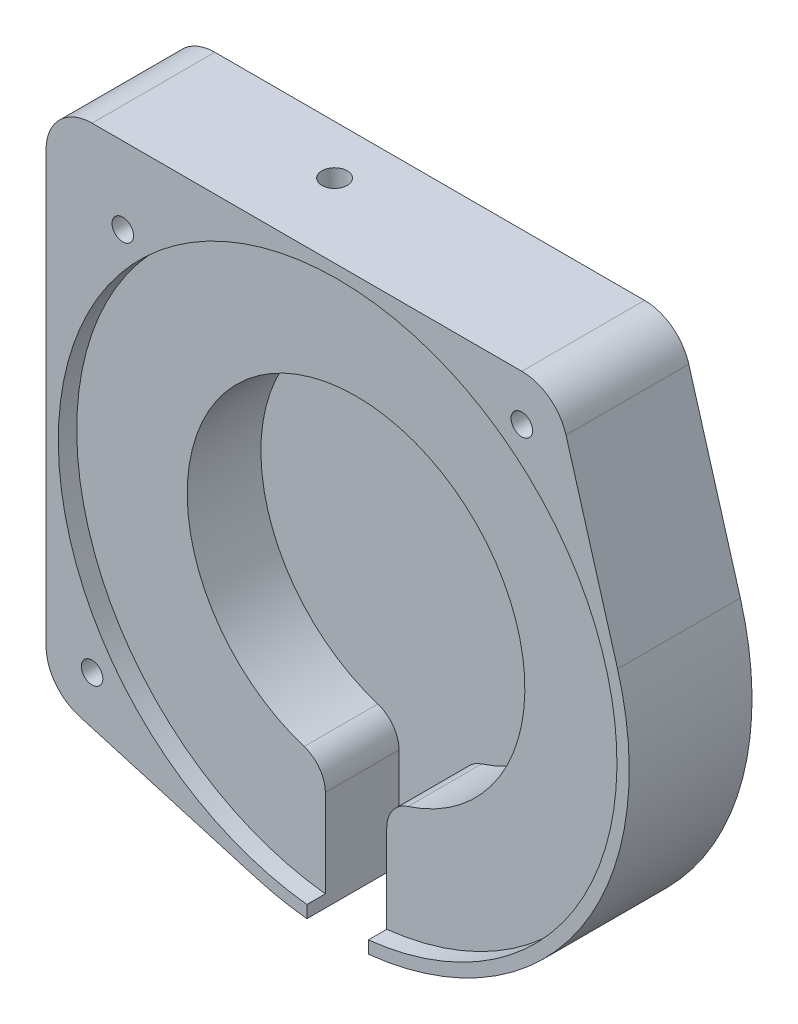
ISO-10303-21;
HEADER;
FILE_DESCRIPTION(('STEP AP214'),'2;1');
FILE_NAME('part.step','',(''),(''),'','','');
FILE_SCHEMA(('AUTOMOTIVE_DESIGN { 1 0 10303 214 1 1 1 1 }'));
ENDSEC;
DATA;
#1=APPLICATION_CONTEXT('core data for automotive mechanical design processes');
#2=APPLICATION_PROTOCOL_DEFINITION('international standard','automotive_design',2000,#1);
#3=PRODUCT_CONTEXT('',#1,'mechanical');
#4=PRODUCT('Part','Part','',(#3));
#5=PRODUCT_RELATED_PRODUCT_CATEGORY('part','',(#4));
#6=PRODUCT_DEFINITION_FORMATION('','',#4);
#7=PRODUCT_DEFINITION_CONTEXT('part definition',#1,'design');
#8=PRODUCT_DEFINITION('design','',#6,#7);
#9=PRODUCT_DEFINITION_SHAPE('','',#8);
#10=(LENGTH_UNIT() NAMED_UNIT(*) SI_UNIT(.MILLI.,.METRE.));
#11=(NAMED_UNIT(*) PLANE_ANGLE_UNIT() SI_UNIT($,.RADIAN.));
#12=(NAMED_UNIT(*) SI_UNIT($,.STERADIAN.) SOLID_ANGLE_UNIT());
#13=UNCERTAINTY_MEASURE_WITH_UNIT(LENGTH_MEASURE(1.E-05),#10,'distance_accuracy_value','');
#14=(GEOMETRIC_REPRESENTATION_CONTEXT(3) GLOBAL_UNCERTAINTY_ASSIGNED_CONTEXT((#13)) GLOBAL_UNIT_ASSIGNED_CONTEXT((#10,
#11,#12)) REPRESENTATION_CONTEXT('',''));
#15=CARTESIAN_POINT('',(0.,0.,0.));
#16=DIRECTION('',(0.,0.,1.));
#17=DIRECTION('',(1.,0.,0.));
#18=AXIS2_PLACEMENT_3D('',#15,#16,#17);
#19=CARTESIAN_POINT('',(-35.5000000012069,12.5,8.));
#20=DIRECTION('',(-1.,0.,0.));
#21=DIRECTION('',(0.,0.,1.));
#22=AXIS2_PLACEMENT_3D('',#19,#20,#21);
#23=CONICAL_SURFACE('',#22,2.06699999931016,1.02974425749021);
#24=CARTESIAN_POINT('',(-34.2580210987649,12.5,7.99999999998136));
#25=VERTEX_POINT('',#24);
#26=VERTEX_LOOP('',#25);
#27=FACE_BOUND('',#26,.T.);
#28=CARTESIAN_POINT('',(-35.5,12.5,8.));
#29=DIRECTION('',(-1.,0.,0.));
#30=DIRECTION('',(0.,-1.,0.));
#31=AXIS2_PLACEMENT_3D('',#28,#29,#30);
#32=CIRCLE('',#31,2.067);
#33=CARTESIAN_POINT('',(-35.5,10.433,8.));
#34=VERTEX_POINT('',#33);
#35=EDGE_CURVE('E247',#34,#34,#32,.T.);
#36=ORIENTED_EDGE('',*,*,#35,.T.);
#37=EDGE_LOOP('',(#36));
#38=FACE_BOUND('',#37,.T.);
#39=ADVANCED_FACE('F17',(#27,#38),#23,.F.);
#40=CARTESIAN_POINT('',(0.,0.,17.));
#41=DIRECTION('',(0.,0.,-1.));
#42=DIRECTION('',(-1.,0.,0.));
#43=AXIS2_PLACEMENT_3D('',#40,#41,#42);
#44=PLANE('',#43);
#45=CARTESIAN_POINT('',(-9.99999999999999,-30.9232921921325,17.));
#46=DIRECTION('',(0.,0.,-1.));
#47=DIRECTION('',(-1.,0.,0.));
#48=AXIS2_PLACEMENT_3D('',#45,#46,#47);
#49=CIRCLE('',#48,5.00000000000001);
#50=CARTESIAN_POINT('',(-8.46153846153846,-26.1658626241121,17.));
#51=VERTEX_POINT('',#50);
#52=CARTESIAN_POINT('',(-4.99999999999999,-30.9232921921325,17.));
#53=VERTEX_POINT('',#52);
#54=EDGE_CURVE('E249',#51,#53,#49,.T.);
#55=ORIENTED_EDGE('',*,*,#54,.F.);
#56=CARTESIAN_POINT('',(0.,0.,17.));
#57=DIRECTION('',(0.,0.,-1.));
#58=DIRECTION('',(-1.,0.,0.));
#59=AXIS2_PLACEMENT_3D('',#56,#57,#58);
#60=CIRCLE('',#59,27.5);
#61=CARTESIAN_POINT('',(8.46153846153848,-26.1658626241121,17.));
#62=VERTEX_POINT('',#61);
#63=EDGE_CURVE('E139',#51,#62,#60,.T.);
#64=ORIENTED_EDGE('',*,*,#63,.T.);
#65=CARTESIAN_POINT('',(10.,-30.9232921921325,17.));
#66=DIRECTION('',(0.,0.,-1.));
#67=DIRECTION('',(-1.,0.,0.));
#68=AXIS2_PLACEMENT_3D('',#65,#66,#67);
#69=CIRCLE('',#68,5.00000000000002);
#70=CARTESIAN_POINT('',(5.00000000000003,-30.9232921921325,17.));
#71=VERTEX_POINT('',#70);
#72=EDGE_CURVE('E20',#71,#62,#69,.T.);
#73=ORIENTED_EDGE('',*,*,#72,.F.);
#74=DIRECTION('',(0.,1.,0.));
#75=VECTOR('',#74,1.);
#76=CARTESIAN_POINT('',(5.00000000000003,-54.6353623105085,17.));
#77=LINE('',#76,#75);
#78=CARTESIAN_POINT('',(5.00000000000003,-45.224440295044,17.));
#79=VERTEX_POINT('',#78);
#80=EDGE_CURVE('E138',#71,#79,#77,.F.);
#81=ORIENTED_EDGE('',*,*,#80,.T.);
#82=CARTESIAN_POINT('',(0.,0.,17.));
#83=DIRECTION('',(0.,0.,-1.));
#84=DIRECTION('',(-1.,0.,0.));
#85=AXIS2_PLACEMENT_3D('',#82,#83,#84);
#86=CIRCLE('',#85,45.5);
#87=CARTESIAN_POINT('',(-4.99999999999999,-45.224440295044,17.));
#88=VERTEX_POINT('',#87);
#89=EDGE_CURVE('E244',#79,#88,#86,.F.);
#90=ORIENTED_EDGE('',*,*,#89,.T.);
#91=DIRECTION('',(0.,1.,0.));
#92=VECTOR('',#91,1.);
#93=CARTESIAN_POINT('',(-4.99999999999999,-30.9232921921325,17.));
#94=LINE('',#93,#92);
#95=EDGE_CURVE('E160',#88,#53,#94,.T.);
#96=ORIENTED_EDGE('',*,*,#95,.T.);
#97=EDGE_LOOP('',(#55,#64,#73,#81,#90,#96));
#98=FACE_BOUND('',#97,.T.);
#99=ADVANCED_FACE('F137',(#98),#44,.F.);
#100=CARTESIAN_POINT('',(10.,-30.9232921921325,20.));
#101=DIRECTION('',(0.,0.,-1.));
#102=DIRECTION('',(-1.,0.,0.));
#103=AXIS2_PLACEMENT_3D('',#100,#101,#102);
#104=CYLINDRICAL_SURFACE('',#103,5.00000000000002);
#105=CARTESIAN_POINT('',(10.,-30.9232921921325,5.));
#106=DIRECTION('',(0.,0.,-1.));
#107=DIRECTION('',(-1.,0.,0.));
#108=AXIS2_PLACEMENT_3D('',#105,#106,#107);
#109=CIRCLE('',#108,5.00000000000002);
#110=CARTESIAN_POINT('',(5.00000000000002,-30.9232921921325,5.));
#111=VERTEX_POINT('',#110);
#112=CARTESIAN_POINT('',(8.46153846153848,-26.1658626241121,5.));
#113=VERTEX_POINT('',#112);
#114=EDGE_CURVE('E158',#111,#113,#109,.T.);
#115=ORIENTED_EDGE('',*,*,#114,.F.);
#116=DIRECTION('',(0.,0.,-1.));
#117=VECTOR('',#116,1.);
#118=CARTESIAN_POINT('',(5.00000000000003,-30.9232921921325,20.));
#119=LINE('',#118,#117);
#120=EDGE_CURVE('E149',#111,#71,#119,.F.);
#121=ORIENTED_EDGE('',*,*,#120,.T.);
#122=ORIENTED_EDGE('',*,*,#72,.T.);
#123=DIRECTION('',(0.,0.,-1.));
#124=VECTOR('',#123,1.);
#125=CARTESIAN_POINT('',(8.46153846153848,-26.1658626241121,20.));
#126=LINE('',#125,#124);
#127=EDGE_CURVE('E144',#62,#113,#126,.T.);
#128=ORIENTED_EDGE('',*,*,#127,.T.);
#129=EDGE_LOOP('',(#115,#121,#122,#128));
#130=FACE_BOUND('',#129,.T.);
#131=ADVANCED_FACE('F157',(#130),#104,.T.);
#132=CARTESIAN_POINT('',(0.,0.,20.));
#133=DIRECTION('',(0.,0.,-1.));
#134=DIRECTION('',(-1.,0.,0.));
#135=AXIS2_PLACEMENT_3D('',#132,#133,#134);
#136=CYLINDRICAL_SURFACE('',#135,27.5);
#137=DIRECTION('',(0.,0.,-1.));
#138=VECTOR('',#137,1.);
#139=CARTESIAN_POINT('',(-8.46153846153846,-26.1658626241121,20.));
#140=LINE('',#139,#138);
#141=CARTESIAN_POINT('',(-8.46153846153846,-26.1658626241121,5.));
#142=VERTEX_POINT('',#141);
#143=EDGE_CURVE('E248',#142,#51,#140,.F.);
#144=ORIENTED_EDGE('',*,*,#143,.F.);
#145=CARTESIAN_POINT('',(0.,0.,5.));
#146=DIRECTION('',(0.,0.,-1.));
#147=DIRECTION('',(-1.,0.,0.));
#148=AXIS2_PLACEMENT_3D('',#145,#146,#147);
#149=CIRCLE('',#148,27.5);
#150=EDGE_CURVE('E240',#113,#142,#149,.F.);
#151=ORIENTED_EDGE('',*,*,#150,.F.);
#152=ORIENTED_EDGE('',*,*,#127,.F.);
#153=ORIENTED_EDGE('',*,*,#63,.F.);
#154=EDGE_LOOP('',(#144,#151,#152,#153));
#155=FACE_BOUND('',#154,.T.);
#156=ADVANCED_FACE('F253',(#155),#136,.F.);
#157=CARTESIAN_POINT('',(-9.99999999999999,-30.9232921921325,20.));
#158=DIRECTION('',(0.,0.,-1.));
#159=DIRECTION('',(-1.,0.,0.));
#160=AXIS2_PLACEMENT_3D('',#157,#158,#159);
#161=CYLINDRICAL_SURFACE('',#160,5.00000000000001);
#162=CARTESIAN_POINT('',(-9.99999999999999,-30.9232921921325,5.));
#163=DIRECTION('',(0.,0.,-1.));
#164=DIRECTION('',(-1.,0.,0.));
#165=AXIS2_PLACEMENT_3D('',#162,#163,#164);
#166=CIRCLE('',#165,5.00000000000001);
#167=CARTESIAN_POINT('',(-4.99999999999999,-30.9232921921325,5.));
#168=VERTEX_POINT('',#167);
#169=EDGE_CURVE('E237',#142,#168,#166,.T.);
#170=ORIENTED_EDGE('',*,*,#169,.F.);
#171=ORIENTED_EDGE('',*,*,#143,.T.);
#172=ORIENTED_EDGE('',*,*,#54,.T.);
#173=DIRECTION('',(0.,0.,1.));
#174=VECTOR('',#173,1.);
#175=CARTESIAN_POINT('',(-4.99999999999999,-30.9232921921325,20.));
#176=LINE('',#175,#174);
#177=EDGE_CURVE('E276',#53,#168,#176,.F.);
#178=ORIENTED_EDGE('',*,*,#177,.T.);
#179=EDGE_LOOP('',(#170,#171,#172,#178));
#180=FACE_BOUND('',#179,.T.);
#181=ADVANCED_FACE('F282',(#180),#161,.T.);
#182=CARTESIAN_POINT('',(-12.5,35.5000000012069,8.));
#183=DIRECTION('',(0.,1.,0.));
#184=DIRECTION('',(0.,0.,1.));
#185=AXIS2_PLACEMENT_3D('',#182,#183,#184);
#186=CONICAL_SURFACE('',#185,2.06699999928334,1.02974425746661);
#187=CARTESIAN_POINT('',(-12.5000000001023,34.2580210987649,8.));
#188=VERTEX_POINT('',#187);
#189=VERTEX_LOOP('',#188);
#190=FACE_BOUND('',#189,.T.);
#191=CARTESIAN_POINT('',(-12.5,35.5,8.));
#192=DIRECTION('',(0.,1.,0.));
#193=DIRECTION('',(-1.,0.,0.));
#194=AXIS2_PLACEMENT_3D('',#191,#192,#193);
#195=CIRCLE('',#194,2.067);
#196=CARTESIAN_POINT('',(-14.567,35.5,8.));
#197=VERTEX_POINT('',#196);
#198=EDGE_CURVE('E299',#197,#197,#195,.T.);
#199=ORIENTED_EDGE('',*,*,#198,.T.);
#200=EDGE_LOOP('',(#199));
#201=FACE_BOUND('',#200,.T.);
#202=ADVANCED_FACE('F424',(#190,#201),#186,.F.);
#203=CARTESIAN_POINT('',(0.,0.,20.));
#204=DIRECTION('',(0.,0.,-1.));
#205=DIRECTION('',(-1.,0.,0.));
#206=AXIS2_PLACEMENT_3D('',#203,#204,#205);
#207=CYLINDRICAL_SURFACE('',#206,45.5);
#208=ORIENTED_EDGE('',*,*,#89,.F.);
#209=DIRECTION('',(0.,0.,-1.));
#210=VECTOR('',#209,1.);
#211=CARTESIAN_POINT('',(5.00000000000003,-45.224440295044,20.));
#212=LINE('',#211,#210);
#213=CARTESIAN_POINT('',(5.00000000000002,-45.224440295044,20.));
#214=VERTEX_POINT('',#213);
#215=EDGE_CURVE('E153',#79,#214,#212,.F.);
#216=ORIENTED_EDGE('',*,*,#215,.T.);
#217=CARTESIAN_POINT('',(0.,0.,20.));
#218=DIRECTION('',(0.,0.,-1.));
#219=DIRECTION('',(-1.,0.,0.));
#220=AXIS2_PLACEMENT_3D('',#217,#218,#219);
#221=CIRCLE('',#220,45.5);
#222=CARTESIAN_POINT('',(-4.99999999999998,-45.224440295044,20.));
#223=VERTEX_POINT('',#222);
#224=EDGE_CURVE('E233',#223,#214,#221,.T.);
#225=ORIENTED_EDGE('',*,*,#224,.F.);
#226=DIRECTION('',(0.,0.,1.));
#227=VECTOR('',#226,1.);
#228=CARTESIAN_POINT('',(-4.99999999999999,-45.224440295044,20.));
#229=LINE('',#228,#227);
#230=EDGE_CURVE('E166',#223,#88,#229,.F.);
#231=ORIENTED_EDGE('',*,*,#230,.T.);
#232=EDGE_LOOP('',(#208,#216,#225,#231));
#233=FACE_BOUND('',#232,.T.);
#234=ADVANCED_FACE('F292',(#233),#207,.F.);
#235=CARTESIAN_POINT('',(-41.5,12.5,8.));
#236=DIRECTION('',(-1.,0.,0.));
#237=DIRECTION('',(0.,-1.,0.));
#238=AXIS2_PLACEMENT_3D('',#235,#236,#237);
#239=CYLINDRICAL_SURFACE('',#238,2.067);
#240=ORIENTED_EDGE('',*,*,#35,.F.);
#241=EDGE_LOOP('',(#240));
#242=FACE_BOUND('',#241,.T.);
#243=CARTESIAN_POINT('',(-47.5,12.5,8.));
#244=DIRECTION('',(-1.,0.,0.));
#245=DIRECTION('',(0.,-1.,0.));
#246=AXIS2_PLACEMENT_3D('',#243,#244,#245);
#247=CIRCLE('',#246,2.067);
#248=CARTESIAN_POINT('',(-47.5,10.433,8.));
#249=VERTEX_POINT('',#248);
#250=EDGE_CURVE('E224',#249,#249,#247,.F.);
#251=ORIENTED_EDGE('',*,*,#250,.F.);
#252=EDGE_LOOP('',(#251));
#253=FACE_BOUND('',#252,.T.);
#254=ADVANCED_FACE('F418',(#242,#253),#239,.F.);
#255=CARTESIAN_POINT('',(-4.99999999999999,-30.9232921921325,20.));
#256=DIRECTION('',(-1.,0.,0.));
#257=DIRECTION('',(0.,0.,1.));
#258=AXIS2_PLACEMENT_3D('',#255,#256,#257);
#259=PLANE('',#258);
#260=ORIENTED_EDGE('',*,*,#230,.F.);
#261=DIRECTION('',(0.,1.,0.));
#262=VECTOR('',#261,1.);
#263=CARTESIAN_POINT('',(-4.99999999999998,3.65924685578279,20.));
#264=LINE('',#263,#262);
#265=CARTESIAN_POINT('',(-4.99999999999999,-47.236109069228,20.));
#266=VERTEX_POINT('',#265);
#267=EDGE_CURVE('E236',#266,#223,#264,.T.);
#268=ORIENTED_EDGE('',*,*,#267,.F.);
#269=DIRECTION('',(0.,0.,1.));
#270=VECTOR('',#269,1.);
#271=CARTESIAN_POINT('',(-4.99999999999999,-47.236109069228,0.));
#272=LINE('',#271,#270);
#273=CARTESIAN_POINT('',(-4.99999999999999,-47.236109069228,5.));
#274=VERTEX_POINT('',#273);
#275=EDGE_CURVE('E219',#274,#266,#272,.T.);
#276=ORIENTED_EDGE('',*,*,#275,.F.);
#277=DIRECTION('',(0.,1.,0.));
#278=VECTOR('',#277,1.);
#279=CARTESIAN_POINT('',(-4.99999999999999,-12.8036137820334,5.));
#280=LINE('',#279,#278);
#281=EDGE_CURVE('E239',#168,#274,#280,.F.);
#282=ORIENTED_EDGE('',*,*,#281,.F.);
#283=ORIENTED_EDGE('',*,*,#177,.F.);
#284=ORIENTED_EDGE('',*,*,#95,.F.);
#285=EDGE_LOOP('',(#260,#268,#276,#282,#283,#284));
#286=FACE_BOUND('',#285,.T.);
#287=ADVANCED_FACE('F286',(#286),#259,.F.);
#288=CARTESIAN_POINT('',(5.00000000000003,-54.6353623105085,20.));
#289=DIRECTION('',(1.,0.,0.));
#290=DIRECTION('',(0.,0.,-1.));
#291=AXIS2_PLACEMENT_3D('',#288,#289,#290);
#292=PLANE('',#291);
#293=ORIENTED_EDGE('',*,*,#120,.F.);
#294=DIRECTION('',(0.,1.,0.));
#295=VECTOR('',#294,1.);
#296=CARTESIAN_POINT('',(5.00000000000002,-12.8036137820334,5.));
#297=LINE('',#296,#295);
#298=CARTESIAN_POINT('',(5.00000000000002,-47.236109069228,5.));
#299=VERTEX_POINT('',#298);
#300=EDGE_CURVE('E154',#299,#111,#297,.T.);
#301=ORIENTED_EDGE('',*,*,#300,.F.);
#302=DIRECTION('',(0.,0.,1.));
#303=VECTOR('',#302,1.);
#304=CARTESIAN_POINT('',(5.00000000000002,-47.236109069228,0.));
#305=LINE('',#304,#303);
#306=CARTESIAN_POINT('',(5.00000000000002,-47.236109069228,20.));
#307=VERTEX_POINT('',#306);
#308=EDGE_CURVE('E212',#307,#299,#305,.F.);
#309=ORIENTED_EDGE('',*,*,#308,.F.);
#310=DIRECTION('',(0.,1.,0.));
#311=VECTOR('',#310,1.);
#312=CARTESIAN_POINT('',(5.00000000000002,3.65924685578279,20.));
#313=LINE('',#312,#311);
#314=EDGE_CURVE('E232',#214,#307,#313,.F.);
#315=ORIENTED_EDGE('',*,*,#314,.F.);
#316=ORIENTED_EDGE('',*,*,#215,.F.);
#317=ORIENTED_EDGE('',*,*,#80,.F.);
#318=EDGE_LOOP('',(#293,#301,#309,#315,#316,#317));
#319=FACE_BOUND('',#318,.T.);
#320=ADVANCED_FACE('F147',(#319),#292,.F.);
#321=CARTESIAN_POINT('',(0.,-12.8036137820334,5.));
#322=DIRECTION('',(0.,0.,1.));
#323=DIRECTION('',(1.,0.,0.));
#324=AXIS2_PLACEMENT_3D('',#321,#322,#323);
#325=PLANE('',#324);
#326=ORIENTED_EDGE('',*,*,#169,.T.);
#327=ORIENTED_EDGE('',*,*,#281,.T.);
#328=CARTESIAN_POINT('',(0.,0.,5.));
#329=DIRECTION('',(0.,0.,1.));
#330=DIRECTION('',(1.,0.,0.));
#331=AXIS2_PLACEMENT_3D('',#328,#329,#330);
#332=CIRCLE('',#331,47.5);
#333=EDGE_CURVE('E208',#299,#274,#332,.F.);
#334=ORIENTED_EDGE('',*,*,#333,.F.);
#335=ORIENTED_EDGE('',*,*,#300,.T.);
#336=ORIENTED_EDGE('',*,*,#114,.T.);
#337=ORIENTED_EDGE('',*,*,#150,.T.);
#338=EDGE_LOOP('',(#326,#327,#334,#335,#336,#337));
#339=FACE_BOUND('',#338,.T.);
#340=ADVANCED_FACE('F257',(#339),#325,.T.);
#341=CARTESIAN_POINT('',(-12.5,41.5,8.));
#342=DIRECTION('',(0.,1.,0.));
#343=DIRECTION('',(-1.,0.,0.));
#344=AXIS2_PLACEMENT_3D('',#341,#342,#343);
#345=CYLINDRICAL_SURFACE('',#344,2.067);
#346=ORIENTED_EDGE('',*,*,#198,.F.);
#347=EDGE_LOOP('',(#346));
#348=FACE_BOUND('',#347,.T.);
#349=CARTESIAN_POINT('',(-12.5,47.5,8.));
#350=DIRECTION('',(0.,1.,0.));
#351=DIRECTION('',(-1.,0.,0.));
#352=AXIS2_PLACEMENT_3D('',#349,#350,#351);
#353=CIRCLE('',#352,2.067);
#354=CARTESIAN_POINT('',(-14.567,47.5,8.));
#355=VERTEX_POINT('',#354);
#356=EDGE_CURVE('E200',#355,#355,#353,.F.);
#357=ORIENTED_EDGE('',*,*,#356,.F.);
#358=EDGE_LOOP('',(#357));
#359=FACE_BOUND('',#358,.T.);
#360=ADVANCED_FACE('F400',(#348,#359),#345,.F.);
#361=CARTESIAN_POINT('',(-3.65924685578279,3.65924685578279,20.));
#362=DIRECTION('',(0.,0.,1.));
#363=DIRECTION('',(1.,0.,0.));
#364=AXIS2_PLACEMENT_3D('',#361,#362,#363);
#365=PLANE('',#364);
#366=CARTESIAN_POINT('',(-40.,-30.,20.));
#367=DIRECTION('',(0.,0.,1.));
#368=DIRECTION('',(1.,0.,0.));
#369=AXIS2_PLACEMENT_3D('',#366,#367,#368);
#370=CIRCLE('',#369,1.75);
#371=CARTESIAN_POINT('',(-38.25,-30.,20.));
#372=VERTEX_POINT('',#371);
#373=EDGE_CURVE('E190',#372,#372,#370,.F.);
#374=ORIENTED_EDGE('',*,*,#373,.T.);
#375=EDGE_LOOP('',(#374));
#376=FACE_BOUND('',#375,.T.);
#377=CARTESIAN_POINT('',(-35.,35.,20.));
#378=DIRECTION('',(0.,0.,1.));
#379=DIRECTION('',(1.,0.,0.));
#380=AXIS2_PLACEMENT_3D('',#377,#378,#379);
#381=CIRCLE('',#380,1.75);
#382=CARTESIAN_POINT('',(-33.25,35.,20.));
#383=VERTEX_POINT('',#382);
#384=EDGE_CURVE('E194',#383,#383,#381,.F.);
#385=ORIENTED_EDGE('',*,*,#384,.T.);
#386=EDGE_LOOP('',(#385));
#387=FACE_BOUND('',#386,.T.);
#388=CARTESIAN_POINT('',(30.,40.,20.));
#389=DIRECTION('',(0.,0.,1.));
#390=DIRECTION('',(1.,0.,0.));
#391=AXIS2_PLACEMENT_3D('',#388,#389,#390);
#392=CIRCLE('',#391,1.75);
#393=CARTESIAN_POINT('',(31.75,40.,20.));
#394=VERTEX_POINT('',#393);
#395=EDGE_CURVE('E197',#394,#394,#392,.F.);
#396=ORIENTED_EDGE('',*,*,#395,.T.);
#397=EDGE_LOOP('',(#396));
#398=FACE_BOUND('',#397,.T.);
#399=DIRECTION('',(0.96,-0.279999999999999,0.));
#400=VECTOR('',#399,1.);
#401=CARTESIAN_POINT('',(-13.3,-45.6,20.));
#402=LINE('',#401,#400);
#403=CARTESIAN_POINT('',(-13.3,-45.6,20.));
#404=VERTEX_POINT('',#403);
#405=CARTESIAN_POINT('',(-42.1,-37.2,20.));
#406=VERTEX_POINT('',#405);
#407=EDGE_CURVE('E268',#404,#406,#402,.F.);
#408=ORIENTED_EDGE('',*,*,#407,.F.);
#409=CARTESIAN_POINT('',(0.,0.,20.));
#410=DIRECTION('',(0.,0.,1.));
#411=DIRECTION('',(1.,0.,0.));
#412=AXIS2_PLACEMENT_3D('',#409,#410,#411);
#413=CIRCLE('',#412,47.5);
#414=EDGE_CURVE('E217',#266,#404,#413,.F.);
#415=ORIENTED_EDGE('',*,*,#414,.F.);
#416=ORIENTED_EDGE('',*,*,#267,.T.);
#417=ORIENTED_EDGE('',*,*,#224,.T.);
#418=ORIENTED_EDGE('',*,*,#314,.T.);
#419=CARTESIAN_POINT('',(0.,0.,20.));
#420=DIRECTION('',(0.,0.,1.));
#421=DIRECTION('',(1.,0.,0.));
#422=AXIS2_PLACEMENT_3D('',#419,#420,#421);
#423=CIRCLE('',#422,47.5);
#424=CARTESIAN_POINT('',(45.6,13.3,20.));
#425=VERTEX_POINT('',#424);
#426=EDGE_CURVE('E213',#425,#307,#423,.F.);
#427=ORIENTED_EDGE('',*,*,#426,.F.);
#428=DIRECTION('',(-0.28,0.96,0.));
#429=VECTOR('',#428,1.);
#430=CARTESIAN_POINT('',(37.2,42.1,20.));
#431=LINE('',#430,#429);
#432=CARTESIAN_POINT('',(37.2,42.1,20.));
#433=VERTEX_POINT('',#432);
#434=EDGE_CURVE('E211',#433,#425,#431,.F.);
#435=ORIENTED_EDGE('',*,*,#434,.F.);
#436=CARTESIAN_POINT('',(30.,40.,20.));
#437=DIRECTION('',(0.,0.,1.));
#438=DIRECTION('',(1.,0.,0.));
#439=AXIS2_PLACEMENT_3D('',#436,#437,#438);
#440=CIRCLE('',#439,7.5);
#441=CARTESIAN_POINT('',(30.,47.5,20.));
#442=VERTEX_POINT('',#441);
#443=EDGE_CURVE('E204',#442,#433,#440,.F.);
#444=ORIENTED_EDGE('',*,*,#443,.F.);
#445=DIRECTION('',(1.,0.,0.));
#446=VECTOR('',#445,1.);
#447=CARTESIAN_POINT('',(-40.,47.5,20.));
#448=LINE('',#447,#446);
#449=CARTESIAN_POINT('',(-40.,47.5,20.));
#450=VERTEX_POINT('',#449);
#451=EDGE_CURVE('E308',#450,#442,#448,.T.);
#452=ORIENTED_EDGE('',*,*,#451,.F.);
#453=CARTESIAN_POINT('',(-40.,40.,20.));
#454=DIRECTION('',(0.,0.,1.));
#455=DIRECTION('',(1.,0.,0.));
#456=AXIS2_PLACEMENT_3D('',#453,#454,#455);
#457=CIRCLE('',#456,7.49999999999999);
#458=CARTESIAN_POINT('',(-47.5,40.,20.));
#459=VERTEX_POINT('',#458);
#460=EDGE_CURVE('E229',#459,#450,#457,.F.);
#461=ORIENTED_EDGE('',*,*,#460,.F.);
#462=DIRECTION('',(0.,1.,0.));
#463=VECTOR('',#462,1.);
#464=CARTESIAN_POINT('',(-47.5,-30.,20.));
#465=LINE('',#464,#463);
#466=CARTESIAN_POINT('',(-47.5,-30.,20.));
#467=VERTEX_POINT('',#466);
#468=EDGE_CURVE('E231',#467,#459,#465,.T.);
#469=ORIENTED_EDGE('',*,*,#468,.F.);
#470=CARTESIAN_POINT('',(-40.,-30.,20.));
#471=DIRECTION('',(0.,0.,1.));
#472=DIRECTION('',(1.,0.,0.));
#473=AXIS2_PLACEMENT_3D('',#470,#471,#472);
#474=CIRCLE('',#473,7.5);
#475=EDGE_CURVE('E220',#406,#467,#474,.F.);
#476=ORIENTED_EDGE('',*,*,#475,.F.);
#477=EDGE_LOOP('',(#408,#415,#416,#417,#418,#427,#435,#444,#452,#461,#469,#476));
#478=FACE_BOUND('',#477,.T.);
#479=ADVANCED_FACE('F295',(#376,#387,#398,#478),#365,.T.);
#480=CARTESIAN_POINT('',(-40.,40.,0.));
#481=DIRECTION('',(0.,0.,1.));
#482=DIRECTION('',(1.,0.,0.));
#483=AXIS2_PLACEMENT_3D('',#480,#481,#482);
#484=CYLINDRICAL_SURFACE('',#483,7.49999999999999);
#485=CARTESIAN_POINT('',(-40.,40.,0.));
#486=DIRECTION('',(0.,0.,1.));
#487=DIRECTION('',(1.,0.,0.));
#488=AXIS2_PLACEMENT_3D('',#485,#486,#487);
#489=CIRCLE('',#488,7.49999999999999);
#490=CARTESIAN_POINT('',(-40.,47.5,0.));
#491=VERTEX_POINT('',#490);
#492=CARTESIAN_POINT('',(-47.5,40.,0.));
#493=VERTEX_POINT('',#492);
#494=EDGE_CURVE('E187',#491,#493,#489,.T.);
#495=ORIENTED_EDGE('',*,*,#494,.T.);
#496=DIRECTION('',(0.,0.,1.));
#497=VECTOR('',#496,1.);
#498=CARTESIAN_POINT('',(-47.5,40.,0.));
#499=LINE('',#498,#497);
#500=EDGE_CURVE('E228',#459,#493,#499,.F.);
#501=ORIENTED_EDGE('',*,*,#500,.F.);
#502=ORIENTED_EDGE('',*,*,#460,.T.);
#503=DIRECTION('',(0.,0.,1.));
#504=VECTOR('',#503,1.);
#505=CARTESIAN_POINT('',(-40.,47.5,0.));
#506=LINE('',#505,#504);
#507=EDGE_CURVE('E203',#491,#450,#506,.T.);
#508=ORIENTED_EDGE('',*,*,#507,.F.);
#509=EDGE_LOOP('',(#495,#501,#502,#508));
#510=FACE_BOUND('',#509,.T.);
#511=ADVANCED_FACE('F340',(#510),#484,.T.);
#512=CARTESIAN_POINT('',(-47.5,-30.,0.));
#513=DIRECTION('',(-1.,0.,0.));
#514=DIRECTION('',(0.,0.,1.));
#515=AXIS2_PLACEMENT_3D('',#512,#513,#514);
#516=PLANE('',#515);
#517=ORIENTED_EDGE('',*,*,#250,.T.);
#518=EDGE_LOOP('',(#517));
#519=FACE_BOUND('',#518,.T.);
#520=DIRECTION('',(0.,1.,0.));
#521=VECTOR('',#520,1.);
#522=CARTESIAN_POINT('',(-47.5,3.65924685578279,0.));
#523=LINE('',#522,#521);
#524=CARTESIAN_POINT('',(-47.5,-30.,0.));
#525=VERTEX_POINT('',#524);
#526=EDGE_CURVE('E186',#493,#525,#523,.F.);
#527=ORIENTED_EDGE('',*,*,#526,.T.);
#528=DIRECTION('',(0.,0.,1.));
#529=VECTOR('',#528,1.);
#530=CARTESIAN_POINT('',(-47.5,-30.,0.));
#531=LINE('',#530,#529);
#532=EDGE_CURVE('E223',#467,#525,#531,.F.);
#533=ORIENTED_EDGE('',*,*,#532,.F.);
#534=ORIENTED_EDGE('',*,*,#468,.T.);
#535=ORIENTED_EDGE('',*,*,#500,.T.);
#536=EDGE_LOOP('',(#527,#533,#534,#535));
#537=FACE_BOUND('',#536,.T.);
#538=ADVANCED_FACE('F327',(#519,#537),#516,.T.);
#539=CARTESIAN_POINT('',(-40.,-30.,0.));
#540=DIRECTION('',(0.,0.,1.));
#541=DIRECTION('',(1.,0.,0.));
#542=AXIS2_PLACEMENT_3D('',#539,#540,#541);
#543=CYLINDRICAL_SURFACE('',#542,7.5);
#544=CARTESIAN_POINT('',(-40.,-30.,0.));
#545=DIRECTION('',(0.,0.,1.));
#546=DIRECTION('',(1.,0.,0.));
#547=AXIS2_PLACEMENT_3D('',#544,#545,#546);
#548=CIRCLE('',#547,7.5);
#549=CARTESIAN_POINT('',(-42.1,-37.2,0.));
#550=VERTEX_POINT('',#549);
#551=EDGE_CURVE('E182',#525,#550,#548,.T.);
#552=ORIENTED_EDGE('',*,*,#551,.T.);
#553=DIRECTION('',(0.,0.,1.));
#554=VECTOR('',#553,1.);
#555=CARTESIAN_POINT('',(-42.1,-37.2,0.));
#556=LINE('',#555,#554);
#557=EDGE_CURVE('E267',#406,#550,#556,.F.);
#558=ORIENTED_EDGE('',*,*,#557,.F.);
#559=ORIENTED_EDGE('',*,*,#475,.T.);
#560=ORIENTED_EDGE('',*,*,#532,.T.);
#561=EDGE_LOOP('',(#552,#558,#559,#560));
#562=FACE_BOUND('',#561,.T.);
#563=ADVANCED_FACE('F357',(#562),#543,.T.);
#564=CARTESIAN_POINT('',(-13.3,-45.6,0.));
#565=DIRECTION('',(-0.279999999999999,-0.96,0.));
#566=DIRECTION('',(0.96,-0.279999999999999,0.));
#567=AXIS2_PLACEMENT_3D('',#564,#565,#566);
#568=PLANE('',#567);
#569=DIRECTION('',(0.96,-0.279999999999999,0.));
#570=VECTOR('',#569,1.);
#571=CARTESIAN_POINT('',(-42.1,-37.2,0.));
#572=LINE('',#571,#570);
#573=CARTESIAN_POINT('',(-13.3,-45.6,0.));
#574=VERTEX_POINT('',#573);
#575=EDGE_CURVE('E181',#550,#574,#572,.T.);
#576=ORIENTED_EDGE('',*,*,#575,.T.);
#577=DIRECTION('',(0.,0.,1.));
#578=VECTOR('',#577,1.);
#579=CARTESIAN_POINT('',(-13.3,-45.6,0.));
#580=LINE('',#579,#578);
#581=EDGE_CURVE('E216',#404,#574,#580,.F.);
#582=ORIENTED_EDGE('',*,*,#581,.F.);
#583=ORIENTED_EDGE('',*,*,#407,.T.);
#584=ORIENTED_EDGE('',*,*,#557,.T.);
#585=EDGE_LOOP('',(#576,#582,#583,#584));
#586=FACE_BOUND('',#585,.T.);
#587=ADVANCED_FACE('F353',(#586),#568,.T.);
#588=CARTESIAN_POINT('',(0.,0.,0.));
#589=DIRECTION('',(0.,0.,1.));
#590=DIRECTION('',(1.,0.,0.));
#591=AXIS2_PLACEMENT_3D('',#588,#589,#590);
#592=CYLINDRICAL_SURFACE('',#591,47.5);
#593=ORIENTED_EDGE('',*,*,#308,.T.);
#594=ORIENTED_EDGE('',*,*,#333,.T.);
#595=ORIENTED_EDGE('',*,*,#275,.T.);
#596=ORIENTED_EDGE('',*,*,#414,.T.);
#597=ORIENTED_EDGE('',*,*,#581,.T.);
#598=CARTESIAN_POINT('',(0.,0.,0.));
#599=DIRECTION('',(0.,0.,1.));
#600=DIRECTION('',(1.,0.,0.));
#601=AXIS2_PLACEMENT_3D('',#598,#599,#600);
#602=CIRCLE('',#601,47.5);
#603=CARTESIAN_POINT('',(45.6,13.3,0.));
#604=VERTEX_POINT('',#603);
#605=EDGE_CURVE('E178',#574,#604,#602,.T.);
#606=ORIENTED_EDGE('',*,*,#605,.T.);
#607=DIRECTION('',(0.,0.,1.));
#608=VECTOR('',#607,1.);
#609=CARTESIAN_POINT('',(45.6,13.3,0.));
#610=LINE('',#609,#608);
#611=EDGE_CURVE('E207',#425,#604,#610,.F.);
#612=ORIENTED_EDGE('',*,*,#611,.F.);
#613=ORIENTED_EDGE('',*,*,#426,.T.);
#614=EDGE_LOOP('',(#593,#594,#595,#596,#597,#606,#612,#613));
#615=FACE_BOUND('',#614,.T.);
#616=ADVANCED_FACE('F364',(#615),#592,.T.);
#617=CARTESIAN_POINT('',(37.2,42.1,0.));
#618=DIRECTION('',(0.96,0.28,0.));
#619=DIRECTION('',(-0.28,0.96,0.));
#620=AXIS2_PLACEMENT_3D('',#617,#618,#619);
#621=PLANE('',#620);
#622=DIRECTION('',(-0.28,0.96,0.));
#623=VECTOR('',#622,1.);
#624=CARTESIAN_POINT('',(45.6,13.3,0.));
#625=LINE('',#624,#623);
#626=CARTESIAN_POINT('',(37.2,42.1,0.));
#627=VERTEX_POINT('',#626);
#628=EDGE_CURVE('E177',#604,#627,#625,.T.);
#629=ORIENTED_EDGE('',*,*,#628,.T.);
#630=DIRECTION('',(0.,0.,1.));
#631=VECTOR('',#630,1.);
#632=CARTESIAN_POINT('',(37.2,42.1,0.));
#633=LINE('',#632,#631);
#634=EDGE_CURVE('E206',#433,#627,#633,.F.);
#635=ORIENTED_EDGE('',*,*,#634,.F.);
#636=ORIENTED_EDGE('',*,*,#434,.T.);
#637=ORIENTED_EDGE('',*,*,#611,.T.);
#638=EDGE_LOOP('',(#629,#635,#636,#637));
#639=FACE_BOUND('',#638,.T.);
#640=ADVANCED_FACE('F362',(#639),#621,.T.);
#641=CARTESIAN_POINT('',(30.,40.,0.));
#642=DIRECTION('',(0.,0.,1.));
#643=DIRECTION('',(1.,0.,0.));
#644=AXIS2_PLACEMENT_3D('',#641,#642,#643);
#645=CYLINDRICAL_SURFACE('',#644,7.5);
#646=CARTESIAN_POINT('',(30.,40.,0.));
#647=DIRECTION('',(0.,0.,1.));
#648=DIRECTION('',(1.,0.,0.));
#649=AXIS2_PLACEMENT_3D('',#646,#647,#648);
#650=CIRCLE('',#649,7.5);
#651=CARTESIAN_POINT('',(30.,47.5,0.));
#652=VERTEX_POINT('',#651);
#653=EDGE_CURVE('E174',#627,#652,#650,.T.);
#654=ORIENTED_EDGE('',*,*,#653,.T.);
#655=DIRECTION('',(0.,0.,1.));
#656=VECTOR('',#655,1.);
#657=CARTESIAN_POINT('',(30.,47.5,0.));
#658=LINE('',#657,#656);
#659=EDGE_CURVE('E36',#442,#652,#658,.F.);
#660=ORIENTED_EDGE('',*,*,#659,.F.);
#661=ORIENTED_EDGE('',*,*,#443,.T.);
#662=ORIENTED_EDGE('',*,*,#634,.T.);
#663=EDGE_LOOP('',(#654,#660,#661,#662));
#664=FACE_BOUND('',#663,.T.);
#665=ADVANCED_FACE('F361',(#664),#645,.T.);
#666=CARTESIAN_POINT('',(-40.,47.5,0.));
#667=DIRECTION('',(0.,1.,0.));
#668=DIRECTION('',(0.,0.,1.));
#669=AXIS2_PLACEMENT_3D('',#666,#667,#668);
#670=PLANE('',#669);
#671=ORIENTED_EDGE('',*,*,#356,.T.);
#672=EDGE_LOOP('',(#671));
#673=FACE_BOUND('',#672,.T.);
#674=DIRECTION('',(1.,0.,0.));
#675=VECTOR('',#674,1.);
#676=CARTESIAN_POINT('',(-3.65924685578279,47.5,0.));
#677=LINE('',#676,#675);
#678=EDGE_CURVE('E173',#652,#491,#677,.F.);
#679=ORIENTED_EDGE('',*,*,#678,.T.);
#680=ORIENTED_EDGE('',*,*,#507,.T.);
#681=ORIENTED_EDGE('',*,*,#451,.T.);
#682=ORIENTED_EDGE('',*,*,#659,.T.);
#683=EDGE_LOOP('',(#679,#680,#681,#682));
#684=FACE_BOUND('',#683,.T.);
#685=ADVANCED_FACE('F343',(#673,#684),#670,.T.);
#686=CARTESIAN_POINT('',(30.,40.,-115.830777072061));
#687=DIRECTION('',(0.,0.,1.));
#688=DIRECTION('',(1.,0.,0.));
#689=AXIS2_PLACEMENT_3D('',#686,#687,#688);
#690=CYLINDRICAL_SURFACE('',#689,1.75);
#691=ORIENTED_EDGE('',*,*,#395,.F.);
#692=EDGE_LOOP('',(#691));
#693=FACE_BOUND('',#692,.T.);
#694=CARTESIAN_POINT('',(30.,40.,0.));
#695=DIRECTION('',(0.,0.,1.));
#696=DIRECTION('',(1.,0.,0.));
#697=AXIS2_PLACEMENT_3D('',#694,#695,#696);
#698=CIRCLE('',#697,1.75);
#699=CARTESIAN_POINT('',(31.75,40.,0.));
#700=VERTEX_POINT('',#699);
#701=EDGE_CURVE('E170',#700,#700,#698,.F.);
#702=ORIENTED_EDGE('',*,*,#701,.T.);
#703=EDGE_LOOP('',(#702));
#704=FACE_BOUND('',#703,.T.);
#705=ADVANCED_FACE('F389',(#693,#704),#690,.F.);
#706=CARTESIAN_POINT('',(-35.,35.,-115.830777072061));
#707=DIRECTION('',(0.,0.,1.));
#708=DIRECTION('',(1.,0.,0.));
#709=AXIS2_PLACEMENT_3D('',#706,#707,#708);
#710=CYLINDRICAL_SURFACE('',#709,1.75);
#711=ORIENTED_EDGE('',*,*,#384,.F.);
#712=EDGE_LOOP('',(#711));
#713=FACE_BOUND('',#712,.T.);
#714=CARTESIAN_POINT('',(-35.,35.,0.));
#715=DIRECTION('',(0.,0.,1.));
#716=DIRECTION('',(1.,0.,0.));
#717=AXIS2_PLACEMENT_3D('',#714,#715,#716);
#718=CIRCLE('',#717,1.75);
#719=CARTESIAN_POINT('',(-33.25,35.,0.));
#720=VERTEX_POINT('',#719);
#721=EDGE_CURVE('E27',#720,#720,#718,.F.);
#722=ORIENTED_EDGE('',*,*,#721,.T.);
#723=EDGE_LOOP('',(#722));
#724=FACE_BOUND('',#723,.T.);
#725=ADVANCED_FACE('F381',(#713,#724),#710,.F.);
#726=CARTESIAN_POINT('',(-40.,-30.,-115.830777072061));
#727=DIRECTION('',(0.,0.,1.));
#728=DIRECTION('',(1.,0.,0.));
#729=AXIS2_PLACEMENT_3D('',#726,#727,#728);
#730=CYLINDRICAL_SURFACE('',#729,1.75);
#731=ORIENTED_EDGE('',*,*,#373,.F.);
#732=EDGE_LOOP('',(#731));
#733=FACE_BOUND('',#732,.T.);
#734=CARTESIAN_POINT('',(-40.,-30.,0.));
#735=DIRECTION('',(0.,0.,1.));
#736=DIRECTION('',(1.,0.,0.));
#737=AXIS2_PLACEMENT_3D('',#734,#735,#736);
#738=CIRCLE('',#737,1.75);
#739=CARTESIAN_POINT('',(-38.25,-30.,0.));
#740=VERTEX_POINT('',#739);
#741=EDGE_CURVE('E11',#740,#740,#738,.F.);
#742=ORIENTED_EDGE('',*,*,#741,.T.);
#743=EDGE_LOOP('',(#742));
#744=FACE_BOUND('',#743,.T.);
#745=ADVANCED_FACE('F375',(#733,#744),#730,.F.);
#746=CARTESIAN_POINT('',(-3.65924685578279,3.65924685578279,0.));
#747=DIRECTION('',(0.,0.,1.));
#748=DIRECTION('',(1.,0.,0.));
#749=AXIS2_PLACEMENT_3D('',#746,#747,#748);
#750=PLANE('',#749);
#751=ORIENTED_EDGE('',*,*,#741,.F.);
#752=EDGE_LOOP('',(#751));
#753=FACE_BOUND('',#752,.T.);
#754=ORIENTED_EDGE('',*,*,#721,.F.);
#755=EDGE_LOOP('',(#754));
#756=FACE_BOUND('',#755,.T.);
#757=ORIENTED_EDGE('',*,*,#701,.F.);
#758=EDGE_LOOP('',(#757));
#759=FACE_BOUND('',#758,.T.);
#760=ORIENTED_EDGE('',*,*,#653,.F.);
#761=ORIENTED_EDGE('',*,*,#628,.F.);
#762=ORIENTED_EDGE('',*,*,#605,.F.);
#763=ORIENTED_EDGE('',*,*,#575,.F.);
#764=ORIENTED_EDGE('',*,*,#551,.F.);
#765=ORIENTED_EDGE('',*,*,#526,.F.);
#766=ORIENTED_EDGE('',*,*,#494,.F.);
#767=ORIENTED_EDGE('',*,*,#678,.F.);
#768=EDGE_LOOP('',(#760,#761,#762,#763,#764,#765,#766,#767));
#769=FACE_BOUND('',#768,.T.);
#770=ADVANCED_FACE('F335',(#753,#756,#759,#769),#750,.F.);
#771=CLOSED_SHELL('',(#39,#99,#131,#156,#181,#202,#234,#254,#287,#320,#340,#360,#479,#511,#538,
#563,#587,#616,#640,#665,#685,#705,#725,#745,#770));
#772=MANIFOLD_SOLID_BREP('B1',#771);
#773=ADVANCED_BREP_SHAPE_REPRESENTATION('',(#18,#772),#14);
#774=SHAPE_DEFINITION_REPRESENTATION(#9,#773);
ENDSEC;
END-ISO-10303-21;
